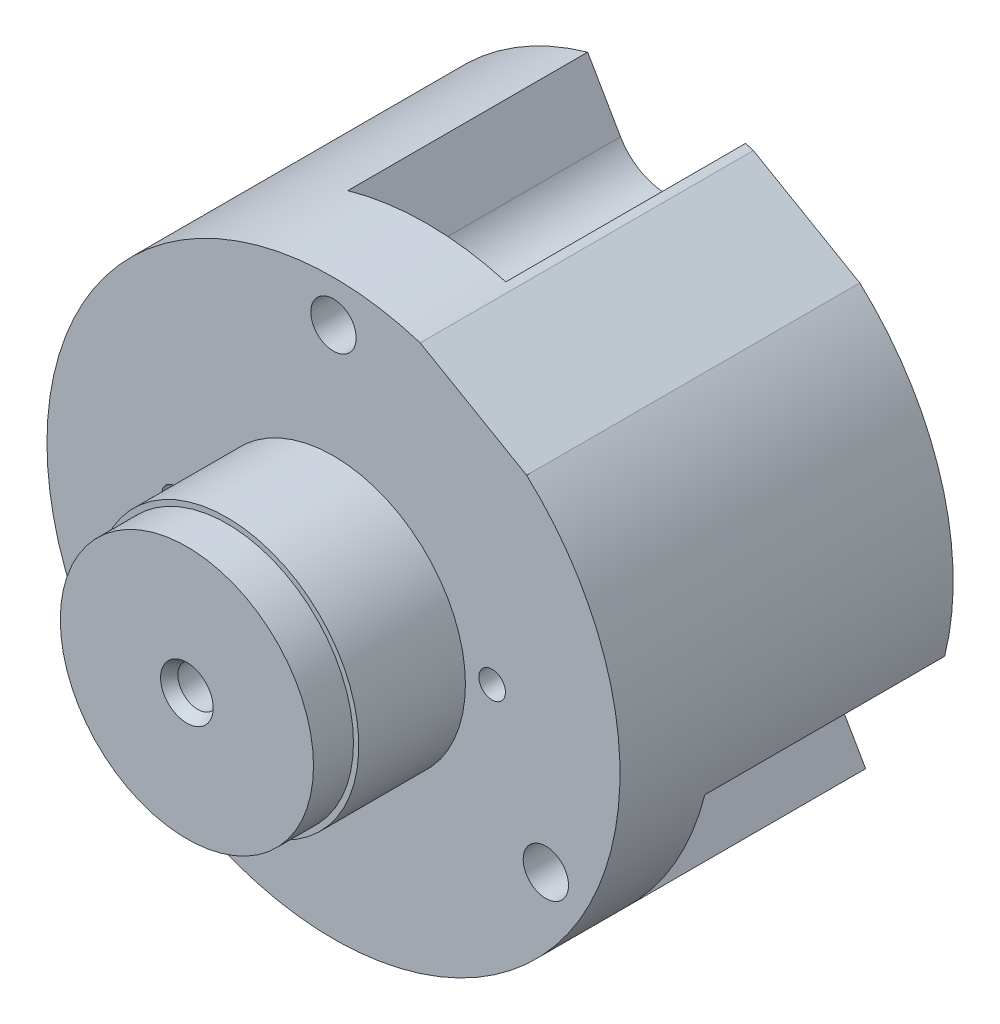
ISO-10303-21;
HEADER;
FILE_DESCRIPTION(('STEP AP214'),'2;1');
FILE_NAME('part.step','',(''),(''),'','','');
FILE_SCHEMA(('AUTOMOTIVE_DESIGN { 1 0 10303 214 1 1 1 1 }'));
ENDSEC;
DATA;
#1=APPLICATION_CONTEXT('core data for automotive mechanical design processes');
#2=APPLICATION_PROTOCOL_DEFINITION('international standard','automotive_design',2000,#1);
#3=PRODUCT_CONTEXT('',#1,'mechanical');
#4=PRODUCT('Part','Part','',(#3));
#5=PRODUCT_RELATED_PRODUCT_CATEGORY('part','',(#4));
#6=PRODUCT_DEFINITION_FORMATION('','',#4);
#7=PRODUCT_DEFINITION_CONTEXT('part definition',#1,'design');
#8=PRODUCT_DEFINITION('design','',#6,#7);
#9=PRODUCT_DEFINITION_SHAPE('','',#8);
#10=(LENGTH_UNIT() NAMED_UNIT(*) SI_UNIT(.MILLI.,.METRE.));
#11=(NAMED_UNIT(*) PLANE_ANGLE_UNIT() SI_UNIT($,.RADIAN.));
#12=(NAMED_UNIT(*) SI_UNIT($,.STERADIAN.) SOLID_ANGLE_UNIT());
#13=UNCERTAINTY_MEASURE_WITH_UNIT(LENGTH_MEASURE(1.E-05),#10,'distance_accuracy_value','');
#14=(GEOMETRIC_REPRESENTATION_CONTEXT(3) GLOBAL_UNCERTAINTY_ASSIGNED_CONTEXT((#13)) GLOBAL_UNIT_ASSIGNED_CONTEXT((#10,
#11,#12)) REPRESENTATION_CONTEXT('',''));
#15=CARTESIAN_POINT('',(0.,0.,0.));
#16=DIRECTION('',(0.,0.,1.));
#17=DIRECTION('',(1.,0.,0.));
#18=AXIS2_PLACEMENT_3D('',#15,#16,#17);
#19=CARTESIAN_POINT('',(0.,0.,-2.));
#20=DIRECTION('',(0.,0.,1.));
#21=DIRECTION('',(1.,0.,0.));
#22=AXIS2_PLACEMENT_3D('',#19,#20,#21);
#23=CYLINDRICAL_SURFACE('',#22,21.5);
#24=DIRECTION('',(0.,0.,-1.));
#25=VECTOR('',#24,1.);
#26=CARTESIAN_POINT('',(14.9341757856194,-15.4667512297903,16.));
#27=LINE('',#26,#25);
#28=CARTESIAN_POINT('',(14.9341757856194,-15.4667512297903,16.));
#29=VERTEX_POINT('',#28);
#30=CARTESIAN_POINT('',(14.9341757856194,-15.4667512297903,-2.));
#31=VERTEX_POINT('',#30);
#32=EDGE_CURVE('E248',#29,#31,#27,.T.);
#33=ORIENTED_EDGE('',*,*,#32,.F.);
#34=CARTESIAN_POINT('',(0.,0.,16.));
#35=DIRECTION('',(0.,0.,-1.));
#36=DIRECTION('',(-1.,0.,0.));
#37=AXIS2_PLACEMENT_3D('',#34,#35,#36);
#38=CIRCLE('',#37,21.5);
#39=CARTESIAN_POINT('',(20.8616873718223,-5.20000000003373,16.));
#40=VERTEX_POINT('',#39);
#41=EDGE_CURVE('E235',#40,#29,#38,.T.);
#42=ORIENTED_EDGE('',*,*,#41,.F.);
#43=DIRECTION('',(0.,0.,-1.));
#44=VECTOR('',#43,1.);
#45=CARTESIAN_POINT('',(20.8616873718223,-5.20000000003373,16.));
#46=LINE('',#45,#44);
#47=CARTESIAN_POINT('',(20.8616873718223,-5.20000000003373,-2.));
#48=VERTEX_POINT('',#47);
#49=EDGE_CURVE('E250',#40,#48,#46,.T.);
#50=ORIENTED_EDGE('',*,*,#49,.T.);
#51=CARTESIAN_POINT('',(0.,0.,-2.));
#52=DIRECTION('',(0.,0.,1.));
#53=DIRECTION('',(1.,0.,0.));
#54=AXIS2_PLACEMENT_3D('',#51,#52,#53);
#55=CIRCLE('',#54,21.5);
#56=CARTESIAN_POINT('',(14.4921798556671,15.8816473651506,-2.));
#57=VERTEX_POINT('',#56);
#58=EDGE_CURVE('E314',#48,#57,#55,.T.);
#59=ORIENTED_EDGE('',*,*,#58,.T.);
#60=DIRECTION('',(0.,0.,1.));
#61=VECTOR('',#60,1.);
#62=CARTESIAN_POINT('',(14.4921798556671,15.8816473651506,-2.));
#63=LINE('',#62,#61);
#64=CARTESIAN_POINT('',(14.4921798556671,15.8816473651506,23.));
#65=VERTEX_POINT('',#64);
#66=EDGE_CURVE('E317',#57,#65,#63,.T.);
#67=ORIENTED_EDGE('',*,*,#66,.T.);
#68=CARTESIAN_POINT('',(0.,0.,23.));
#69=DIRECTION('',(0.,0.,1.));
#70=DIRECTION('',(1.,0.,0.));
#71=AXIS2_PLACEMENT_3D('',#68,#69,#70);
#72=CIRCLE('',#71,21.5);
#73=CARTESIAN_POINT('',(6.50782014433379,20.4914195937959,23.));
#74=VERTEX_POINT('',#73);
#75=EDGE_CURVE('E301',#74,#65,#72,.T.);
#76=ORIENTED_EDGE('',*,*,#75,.F.);
#77=DIRECTION('',(0.,0.,1.));
#78=VECTOR('',#77,1.);
#79=CARTESIAN_POINT('',(6.50782014433379,20.4914195937959,-2.));
#80=LINE('',#79,#78);
#81=CARTESIAN_POINT('',(6.50782014433379,20.4914195937959,-2.));
#82=VERTEX_POINT('',#81);
#83=EDGE_CURVE('E323',#82,#74,#80,.T.);
#84=ORIENTED_EDGE('',*,*,#83,.F.);
#85=CARTESIAN_POINT('',(5.92751158620286,20.666751229824,-2.));
#86=VERTEX_POINT('',#85);
#87=EDGE_CURVE('E309',#82,#86,#55,.T.);
#88=ORIENTED_EDGE('',*,*,#87,.T.);
#89=DIRECTION('',(0.,0.,-1.));
#90=VECTOR('',#89,1.);
#91=CARTESIAN_POINT('',(5.92751158620286,20.666751229824,16.));
#92=LINE('',#91,#90);
#93=CARTESIAN_POINT('',(5.92751158620286,20.666751229824,16.));
#94=VERTEX_POINT('',#93);
#95=EDGE_CURVE('E302',#94,#86,#92,.T.);
#96=ORIENTED_EDGE('',*,*,#95,.F.);
#97=CARTESIAN_POINT('',(0.,0.,16.));
#98=DIRECTION('',(0.,0.,-1.));
#99=DIRECTION('',(-1.,0.,0.));
#100=AXIS2_PLACEMENT_3D('',#97,#98,#99);
#101=CIRCLE('',#100,21.5);
#102=CARTESIAN_POINT('',(-5.92751158620285,20.666751229824,16.));
#103=VERTEX_POINT('',#102);
#104=EDGE_CURVE('E288',#103,#94,#101,.T.);
#105=ORIENTED_EDGE('',*,*,#104,.F.);
#106=DIRECTION('',(0.,0.,-1.));
#107=VECTOR('',#106,1.);
#108=CARTESIAN_POINT('',(-5.92751158620285,20.666751229824,16.));
#109=LINE('',#108,#107);
#110=CARTESIAN_POINT('',(-5.92751158620285,20.666751229824,-2.));
#111=VERTEX_POINT('',#110);
#112=EDGE_CURVE('E304',#103,#111,#109,.T.);
#113=ORIENTED_EDGE('',*,*,#112,.T.);
#114=CARTESIAN_POINT('',(-20.8616873718223,-5.20000000003373,-2.));
#115=VERTEX_POINT('',#114);
#116=EDGE_CURVE('E313',#111,#115,#55,.T.);
#117=ORIENTED_EDGE('',*,*,#116,.T.);
#118=DIRECTION('',(0.,0.,-1.));
#119=VECTOR('',#118,1.);
#120=CARTESIAN_POINT('',(-20.8616873718223,-5.20000000003373,16.));
#121=LINE('',#120,#119);
#122=CARTESIAN_POINT('',(-20.8616873718223,-5.20000000003373,16.));
#123=VERTEX_POINT('',#122);
#124=EDGE_CURVE('E275',#123,#115,#121,.T.);
#125=ORIENTED_EDGE('',*,*,#124,.F.);
#126=CARTESIAN_POINT('',(0.,0.,16.));
#127=DIRECTION('',(0.,0.,-1.));
#128=DIRECTION('',(-1.,0.,0.));
#129=AXIS2_PLACEMENT_3D('',#126,#127,#128);
#130=CIRCLE('',#129,21.5);
#131=CARTESIAN_POINT('',(-14.9341757856194,-15.4667512297902,16.));
#132=VERTEX_POINT('',#131);
#133=EDGE_CURVE('E261',#132,#123,#130,.T.);
#134=ORIENTED_EDGE('',*,*,#133,.F.);
#135=DIRECTION('',(0.,0.,-1.));
#136=VECTOR('',#135,1.);
#137=CARTESIAN_POINT('',(-14.9341757856194,-15.4667512297902,16.));
#138=LINE('',#137,#136);
#139=CARTESIAN_POINT('',(-14.9341757856194,-15.4667512297902,-2.));
#140=VERTEX_POINT('',#139);
#141=EDGE_CURVE('E277',#132,#140,#138,.T.);
#142=ORIENTED_EDGE('',*,*,#141,.T.);
#143=EDGE_CURVE('E508',#140,#31,#55,.T.);
#144=ORIENTED_EDGE('',*,*,#143,.T.);
#145=EDGE_LOOP('',(#33,#42,#50,#59,#67,#76,#84,#88,#96,#105,#113,#117,#125,#134,#142,#144));
#146=FACE_BOUND('',#145,.T.);
#147=ADVANCED_FACE('F36',(#146),#23,.T.);
#148=CARTESIAN_POINT('',(14.4921798556671,15.8816473651506,-2.));
#149=DIRECTION('',(0.500000000000015,0.86602540378443,0.));
#150=DIRECTION('',(-0.86602540378443,0.500000000000015,0.));
#151=AXIS2_PLACEMENT_3D('',#148,#149,#150);
#152=PLANE('',#151);
#153=DIRECTION('',(-0.86602540378443,0.500000000000015,0.));
#154=VECTOR('',#153,1.);
#155=CARTESIAN_POINT('',(14.4921798556671,15.8816473651506,23.));
#156=LINE('',#155,#154);
#157=EDGE_CURVE('E320',#65,#74,#156,.T.);
#158=ORIENTED_EDGE('',*,*,#157,.F.);
#159=ORIENTED_EDGE('',*,*,#66,.F.);
#160=DIRECTION('',(-0.86602540378443,0.500000000000015,0.));
#161=VECTOR('',#160,1.);
#162=CARTESIAN_POINT('',(14.4921798556671,15.8816473651506,-2.));
#163=LINE('',#162,#161);
#164=EDGE_CURVE('E312',#57,#82,#163,.T.);
#165=ORIENTED_EDGE('',*,*,#164,.T.);
#166=ORIENTED_EDGE('',*,*,#83,.T.);
#167=EDGE_LOOP('',(#158,#159,#165,#166));
#168=FACE_BOUND('',#167,.T.);
#169=ADVANCED_FACE('F348',(#168),#152,.T.);
#170=CARTESIAN_POINT('',(0.,0.,-2.));
#171=DIRECTION('',(0.,0.,1.));
#172=DIRECTION('',(1.,0.,0.));
#173=AXIS2_PLACEMENT_3D('',#170,#171,#172);
#174=PLANE('',#173);
#175=CARTESIAN_POINT('',(5.54908495762116,9.49794022813307,-2.));
#176=DIRECTION('',(0.,0.,-1.));
#177=DIRECTION('',(-1.,0.,0.));
#178=AXIS2_PLACEMENT_3D('',#175,#176,#177);
#179=CIRCLE('',#178,1.24999999999999);
#180=CARTESIAN_POINT('',(4.29908495762117,9.49794022813307,-2.));
#181=VERTEX_POINT('',#180);
#182=EDGE_CURVE('E174',#181,#181,#179,.T.);
#183=ORIENTED_EDGE('',*,*,#182,.F.);
#184=EDGE_LOOP('',(#183));
#185=FACE_BOUND('',#184,.T.);
#186=CARTESIAN_POINT('',(-5.45091504237914,-9.55461865512437,-2.));
#187=DIRECTION('',(0.,0.,-1.));
#188=DIRECTION('',(-1.,0.,0.));
#189=AXIS2_PLACEMENT_3D('',#186,#187,#188);
#190=CIRCLE('',#189,1.24999999999999);
#191=CARTESIAN_POINT('',(-6.70091504237913,-9.55461865512437,-2.));
#192=VERTEX_POINT('',#191);
#193=EDGE_CURVE('E180',#192,#192,#190,.T.);
#194=ORIENTED_EDGE('',*,*,#193,.F.);
#195=EDGE_LOOP('',(#194));
#196=FACE_BOUND('',#195,.T.);
#197=CARTESIAN_POINT('',(8.50000000000025,14.7224318643353,-2.));
#198=DIRECTION('',(0.,0.,-1.));
#199=DIRECTION('',(-1.,0.,0.));
#200=AXIS2_PLACEMENT_3D('',#197,#198,#199);
#201=CIRCLE('',#200,1.24999999999999);
#202=CARTESIAN_POINT('',(7.25000000000026,14.7224318643353,-2.));
#203=VERTEX_POINT('',#202);
#204=EDGE_CURVE('E186',#203,#203,#201,.T.);
#205=ORIENTED_EDGE('',*,*,#204,.F.);
#206=EDGE_LOOP('',(#205));
#207=FACE_BOUND('',#206,.T.);
#208=CARTESIAN_POINT('',(-8.50000000000025,-14.7224318643353,-2.));
#209=DIRECTION('',(0.,0.,-1.));
#210=DIRECTION('',(-1.,0.,0.));
#211=AXIS2_PLACEMENT_3D('',#208,#209,#210);
#212=CIRCLE('',#211,1.24999999999999);
#213=CARTESIAN_POINT('',(-9.75000000000024,-14.7224318643353,-2.));
#214=VERTEX_POINT('',#213);
#215=EDGE_CURVE('E192',#214,#214,#212,.T.);
#216=ORIENTED_EDGE('',*,*,#215,.F.);
#217=EDGE_LOOP('',(#216));
#218=FACE_BOUND('',#217,.T.);
#219=CARTESIAN_POINT('',(0.,0.,-2.));
#220=DIRECTION('',(0.,0.,1.));
#221=DIRECTION('',(1.,0.,0.));
#222=AXIS2_PLACEMENT_3D('',#219,#220,#221);
#223=CIRCLE('',#222,1.49999999999999);
#224=CARTESIAN_POINT('',(1.49999999999999,0.,-2.));
#225=VERTEX_POINT('',#224);
#226=EDGE_CURVE('E198',#225,#225,#223,.T.);
#227=ORIENTED_EDGE('',*,*,#226,.T.);
#228=EDGE_LOOP('',(#227));
#229=FACE_BOUND('',#228,.T.);
#230=CARTESIAN_POINT('',(15.9348674296921,-9.20000000003374,-2.));
#231=DIRECTION('',(0.,0.,-1.));
#232=DIRECTION('',(-1.,0.,0.));
#233=AXIS2_PLACEMENT_3D('',#230,#231,#232);
#234=CIRCLE('',#233,4.);
#235=CARTESIAN_POINT('',(12.4707658145543,-11.2000000000337,-2.));
#236=VERTEX_POINT('',#235);
#237=CARTESIAN_POINT('',(15.9348674296921,-5.20000000003374,-2.));
#238=VERTEX_POINT('',#237);
#239=EDGE_CURVE('E51',#236,#238,#234,.T.);
#240=ORIENTED_EDGE('',*,*,#239,.F.);
#241=DIRECTION('',(-0.499999999999999,0.866025403784439,0.));
#242=VECTOR('',#241,1.);
#243=CARTESIAN_POINT('',(14.9341757856194,-15.4667512297903,-2.));
#244=LINE('',#243,#242);
#245=EDGE_CURVE('E232',#31,#236,#244,.T.);
#246=ORIENTED_EDGE('',*,*,#245,.F.);
#247=ORIENTED_EDGE('',*,*,#143,.F.);
#248=DIRECTION('',(-0.499999999999999,-0.866025403784439,0.));
#249=VECTOR('',#248,1.);
#250=CARTESIAN_POINT('',(-12.4707658145543,-11.2000000000337,-2.));
#251=LINE('',#250,#249);
#252=CARTESIAN_POINT('',(-12.4707658145543,-11.2000000000337,-2.));
#253=VERTEX_POINT('',#252);
#254=EDGE_CURVE('E268',#253,#140,#251,.T.);
#255=ORIENTED_EDGE('',*,*,#254,.F.);
#256=CARTESIAN_POINT('',(-15.9348674296921,-9.20000000003373,-2.));
#257=DIRECTION('',(0.,0.,-1.));
#258=DIRECTION('',(-1.,0.,0.));
#259=AXIS2_PLACEMENT_3D('',#256,#257,#258);
#260=CIRCLE('',#259,4.00000000000001);
#261=CARTESIAN_POINT('',(-15.9348674296921,-5.20000000003372,-2.));
#262=VERTEX_POINT('',#261);
#263=EDGE_CURVE('E59',#262,#253,#260,.T.);
#264=ORIENTED_EDGE('',*,*,#263,.F.);
#265=DIRECTION('',(1.,0.,0.));
#266=VECTOR('',#265,1.);
#267=CARTESIAN_POINT('',(-20.8616873718223,-5.20000000003373,-2.));
#268=LINE('',#267,#266);
#269=EDGE_CURVE('E258',#115,#262,#268,.T.);
#270=ORIENTED_EDGE('',*,*,#269,.F.);
#271=ORIENTED_EDGE('',*,*,#116,.F.);
#272=DIRECTION('',(-0.5,0.866025403784438,0.));
#273=VECTOR('',#272,1.);
#274=CARTESIAN_POINT('',(-3.46410161513775,16.4000000000675,-2.));
#275=LINE('',#274,#273);
#276=CARTESIAN_POINT('',(-3.46410161513775,16.4000000000675,-2.));
#277=VERTEX_POINT('',#276);
#278=EDGE_CURVE('E295',#277,#111,#275,.T.);
#279=ORIENTED_EDGE('',*,*,#278,.F.);
#280=CARTESIAN_POINT('',(0.,18.4000000000675,-2.));
#281=DIRECTION('',(0.,0.,-1.));
#282=DIRECTION('',(-1.,0.,0.));
#283=AXIS2_PLACEMENT_3D('',#280,#281,#282);
#284=CIRCLE('',#283,4.);
#285=CARTESIAN_POINT('',(3.46410161513775,16.4000000000675,-2.));
#286=VERTEX_POINT('',#285);
#287=EDGE_CURVE('E274',#286,#277,#284,.T.);
#288=ORIENTED_EDGE('',*,*,#287,.F.);
#289=DIRECTION('',(-0.500000000000002,-0.866025403784438,0.));
#290=VECTOR('',#289,1.);
#291=CARTESIAN_POINT('',(5.92751158620286,20.666751229824,-2.));
#292=LINE('',#291,#290);
#293=EDGE_CURVE('E285',#86,#286,#292,.T.);
#294=ORIENTED_EDGE('',*,*,#293,.F.);
#295=ORIENTED_EDGE('',*,*,#87,.F.);
#296=ORIENTED_EDGE('',*,*,#164,.F.);
#297=ORIENTED_EDGE('',*,*,#58,.F.);
#298=DIRECTION('',(1.,0.,0.));
#299=VECTOR('',#298,1.);
#300=CARTESIAN_POINT('',(15.9348674296921,-5.20000000003374,-2.));
#301=LINE('',#300,#299);
#302=EDGE_CURVE('E242',#238,#48,#301,.T.);
#303=ORIENTED_EDGE('',*,*,#302,.F.);
#304=EDGE_LOOP('',(#240,#246,#247,#255,#264,#270,#271,#279,#288,#294,#295,#296,#297,#303));
#305=FACE_BOUND('',#304,.T.);
#306=ADVANCED_FACE('F353',(#185,#196,#207,#218,#229,#305),#174,.F.);
#307=CARTESIAN_POINT('',(0.,0.,23.));
#308=DIRECTION('',(0.,0.,1.));
#309=DIRECTION('',(1.,0.,0.));
#310=AXIS2_PLACEMENT_3D('',#307,#308,#309);
#311=PLANE('',#310);
#312=CARTESIAN_POINT('',(-11.8870489570875,0.98897274573418,23.));
#313=DIRECTION('',(0.,0.,1.));
#314=DIRECTION('',(1.,0.,0.));
#315=AXIS2_PLACEMENT_3D('',#312,#313,#314);
#316=CIRCLE('',#315,0.999999999999999);
#317=CARTESIAN_POINT('',(-10.8870489570875,0.98897274573418,23.));
#318=VERTEX_POINT('',#317);
#319=EDGE_CURVE('E164',#318,#318,#316,.T.);
#320=ORIENTED_EDGE('',*,*,#319,.F.);
#321=EDGE_LOOP('',(#320));
#322=FACE_BOUND('',#321,.T.);
#323=CARTESIAN_POINT('',(11.9030743608719,0.983270440699366,23.));
#324=DIRECTION('',(0.,0.,1.));
#325=DIRECTION('',(1.,0.,0.));
#326=AXIS2_PLACEMENT_3D('',#323,#324,#325);
#327=CIRCLE('',#326,0.999999999999999);
#328=CARTESIAN_POINT('',(12.9030743608719,0.983270440699366,23.));
#329=VERTEX_POINT('',#328);
#330=EDGE_CURVE('E163',#329,#329,#327,.T.);
#331=ORIENTED_EDGE('',*,*,#330,.F.);
#332=EDGE_LOOP('',(#331));
#333=FACE_BOUND('',#332,.T.);
#334=CARTESIAN_POINT('',(0.,18.4000000000675,23.));
#335=DIRECTION('',(0.,0.,1.));
#336=DIRECTION('',(1.,0.,0.));
#337=AXIS2_PLACEMENT_3D('',#334,#335,#336);
#338=CIRCLE('',#337,1.69999999999999);
#339=CARTESIAN_POINT('',(1.69999999999999,18.4000000000675,23.));
#340=VERTEX_POINT('',#339);
#341=EDGE_CURVE('E204',#340,#340,#338,.T.);
#342=ORIENTED_EDGE('',*,*,#341,.F.);
#343=EDGE_LOOP('',(#342));
#344=FACE_BOUND('',#343,.T.);
#345=CARTESIAN_POINT('',(-15.9348674296921,-9.20000000003374,23.));
#346=DIRECTION('',(0.,0.,1.));
#347=DIRECTION('',(1.,0.,0.));
#348=AXIS2_PLACEMENT_3D('',#345,#346,#347);
#349=CIRCLE('',#348,1.69999999999999);
#350=CARTESIAN_POINT('',(-14.2348674296921,-9.20000000003374,23.));
#351=VERTEX_POINT('',#350);
#352=EDGE_CURVE('E210',#351,#351,#349,.T.);
#353=ORIENTED_EDGE('',*,*,#352,.F.);
#354=EDGE_LOOP('',(#353));
#355=FACE_BOUND('',#354,.T.);
#356=CARTESIAN_POINT('',(15.9348674296921,-9.20000000003374,23.));
#357=DIRECTION('',(0.,0.,1.));
#358=DIRECTION('',(1.,0.,0.));
#359=AXIS2_PLACEMENT_3D('',#356,#357,#358);
#360=CIRCLE('',#359,1.69999999999999);
#361=CARTESIAN_POINT('',(17.6348674296921,-9.20000000003374,23.));
#362=VERTEX_POINT('',#361);
#363=EDGE_CURVE('E216',#362,#362,#360,.T.);
#364=ORIENTED_EDGE('',*,*,#363,.F.);
#365=EDGE_LOOP('',(#364));
#366=FACE_BOUND('',#365,.T.);
#367=CARTESIAN_POINT('',(0.,0.,23.));
#368=DIRECTION('',(0.,0.,1.));
#369=DIRECTION('',(1.,0.,0.));
#370=AXIS2_PLACEMENT_3D('',#367,#368,#369);
#371=CIRCLE('',#370,9.9);
#372=CARTESIAN_POINT('',(9.9,0.,23.));
#373=VERTEX_POINT('',#372);
#374=EDGE_CURVE('E325',#373,#373,#371,.T.);
#375=ORIENTED_EDGE('',*,*,#374,.F.);
#376=EDGE_LOOP('',(#375));
#377=FACE_BOUND('',#376,.T.);
#378=ORIENTED_EDGE('',*,*,#75,.T.);
#379=ORIENTED_EDGE('',*,*,#157,.T.);
#380=EDGE_LOOP('',(#378,#379));
#381=FACE_BOUND('',#380,.T.);
#382=ADVANCED_FACE('F358',(#322,#333,#344,#355,#366,#377,#381),#311,.T.);
#383=CARTESIAN_POINT('',(0.,18.4000000000675,16.));
#384=DIRECTION('',(0.,0.,-1.));
#385=DIRECTION('',(-1.,0.,0.));
#386=AXIS2_PLACEMENT_3D('',#383,#384,#385);
#387=CYLINDRICAL_SURFACE('',#386,4.);
#388=ORIENTED_EDGE('',*,*,#287,.T.);
#389=DIRECTION('',(0.,0.,-1.));
#390=VECTOR('',#389,1.);
#391=CARTESIAN_POINT('',(-3.46410161513775,16.4000000000675,16.));
#392=LINE('',#391,#390);
#393=CARTESIAN_POINT('',(-3.46410161513775,16.4000000000675,16.));
#394=VERTEX_POINT('',#393);
#395=EDGE_CURVE('E293',#394,#277,#392,.T.);
#396=ORIENTED_EDGE('',*,*,#395,.F.);
#397=CARTESIAN_POINT('',(0.,18.4000000000675,16.));
#398=DIRECTION('',(0.,0.,-1.));
#399=DIRECTION('',(-1.,0.,0.));
#400=AXIS2_PLACEMENT_3D('',#397,#398,#399);
#401=CIRCLE('',#400,4.);
#402=CARTESIAN_POINT('',(3.46410161513775,16.4000000000675,16.));
#403=VERTEX_POINT('',#402);
#404=EDGE_CURVE('E281',#403,#394,#401,.T.);
#405=ORIENTED_EDGE('',*,*,#404,.F.);
#406=DIRECTION('',(0.,0.,-1.));
#407=VECTOR('',#406,1.);
#408=CARTESIAN_POINT('',(3.46410161513775,16.4000000000675,16.));
#409=LINE('',#408,#407);
#410=EDGE_CURVE('E299',#403,#286,#409,.T.);
#411=ORIENTED_EDGE('',*,*,#410,.T.);
#412=EDGE_LOOP('',(#388,#396,#405,#411));
#413=FACE_BOUND('',#412,.T.);
#414=ADVANCED_FACE('F361',(#413),#387,.F.);
#415=CARTESIAN_POINT('',(5.92751158620286,20.666751229824,16.));
#416=DIRECTION('',(0.866025403784438,-0.500000000000002,0.));
#417=DIRECTION('',(0.500000000000002,0.866025403784438,0.));
#418=AXIS2_PLACEMENT_3D('',#415,#416,#417);
#419=PLANE('',#418);
#420=ORIENTED_EDGE('',*,*,#293,.T.);
#421=ORIENTED_EDGE('',*,*,#410,.F.);
#422=DIRECTION('',(-0.500000000000002,-0.866025403784438,0.));
#423=VECTOR('',#422,1.);
#424=CARTESIAN_POINT('',(5.92751158620286,20.666751229824,16.));
#425=LINE('',#424,#423);
#426=EDGE_CURVE('E290',#94,#403,#425,.T.);
#427=ORIENTED_EDGE('',*,*,#426,.F.);
#428=ORIENTED_EDGE('',*,*,#95,.T.);
#429=EDGE_LOOP('',(#420,#421,#427,#428));
#430=FACE_BOUND('',#429,.T.);
#431=ADVANCED_FACE('F368',(#430),#419,.F.);
#432=CARTESIAN_POINT('',(-3.46410161513775,16.4000000000675,16.));
#433=DIRECTION('',(-0.866025403784438,-0.5,0.));
#434=DIRECTION('',(0.500000000000001,-0.866025403784438,0.));
#435=AXIS2_PLACEMENT_3D('',#432,#433,#434);
#436=PLANE('',#435);
#437=ORIENTED_EDGE('',*,*,#278,.T.);
#438=ORIENTED_EDGE('',*,*,#112,.F.);
#439=DIRECTION('',(-0.5,0.866025403784438,0.));
#440=VECTOR('',#439,1.);
#441=CARTESIAN_POINT('',(-3.46410161513775,16.4000000000675,16.));
#442=LINE('',#441,#440);
#443=EDGE_CURVE('E284',#394,#103,#442,.T.);
#444=ORIENTED_EDGE('',*,*,#443,.F.);
#445=ORIENTED_EDGE('',*,*,#395,.T.);
#446=EDGE_LOOP('',(#437,#438,#444,#445));
#447=FACE_BOUND('',#446,.T.);
#448=ADVANCED_FACE('F370',(#447),#436,.F.);
#449=CARTESIAN_POINT('',(0.,18.4000000000675,16.));
#450=DIRECTION('',(0.,0.,-1.));
#451=DIRECTION('',(-1.,0.,0.));
#452=AXIS2_PLACEMENT_3D('',#449,#450,#451);
#453=PLANE('',#452);
#454=CARTESIAN_POINT('',(0.,18.4000000000675,16.));
#455=DIRECTION('',(0.,0.,-1.));
#456=DIRECTION('',(-1.,0.,0.));
#457=AXIS2_PLACEMENT_3D('',#454,#455,#456);
#458=CIRCLE('',#457,1.69999999999998);
#459=CARTESIAN_POINT('',(-1.69999999999998,18.4000000000675,16.));
#460=VERTEX_POINT('',#459);
#461=EDGE_CURVE('E201',#460,#460,#458,.T.);
#462=ORIENTED_EDGE('',*,*,#461,.F.);
#463=EDGE_LOOP('',(#462));
#464=FACE_BOUND('',#463,.T.);
#465=ORIENTED_EDGE('',*,*,#404,.T.);
#466=ORIENTED_EDGE('',*,*,#443,.T.);
#467=ORIENTED_EDGE('',*,*,#104,.T.);
#468=ORIENTED_EDGE('',*,*,#426,.T.);
#469=EDGE_LOOP('',(#465,#466,#467,#468));
#470=FACE_BOUND('',#469,.T.);
#471=ADVANCED_FACE('F373',(#464,#470),#453,.T.);
#472=CARTESIAN_POINT('',(-15.9348674296921,-9.20000000003373,16.));
#473=DIRECTION('',(0.,0.,-1.));
#474=DIRECTION('',(-1.,0.,0.));
#475=AXIS2_PLACEMENT_3D('',#472,#473,#474);
#476=CYLINDRICAL_SURFACE('',#475,4.00000000000001);
#477=ORIENTED_EDGE('',*,*,#263,.T.);
#478=DIRECTION('',(0.,0.,-1.));
#479=VECTOR('',#478,1.);
#480=CARTESIAN_POINT('',(-12.4707658145543,-11.2000000000337,16.));
#481=LINE('',#480,#479);
#482=CARTESIAN_POINT('',(-12.4707658145543,-11.2000000000337,16.));
#483=VERTEX_POINT('',#482);
#484=EDGE_CURVE('E266',#483,#253,#481,.T.);
#485=ORIENTED_EDGE('',*,*,#484,.F.);
#486=CARTESIAN_POINT('',(-15.9348674296921,-9.20000000003373,16.));
#487=DIRECTION('',(0.,0.,-1.));
#488=DIRECTION('',(-1.,0.,0.));
#489=AXIS2_PLACEMENT_3D('',#486,#487,#488);
#490=CIRCLE('',#489,4.00000000000001);
#491=CARTESIAN_POINT('',(-15.9348674296921,-5.20000000003372,16.));
#492=VERTEX_POINT('',#491);
#493=EDGE_CURVE('E254',#492,#483,#490,.T.);
#494=ORIENTED_EDGE('',*,*,#493,.F.);
#495=DIRECTION('',(0.,0.,-1.));
#496=VECTOR('',#495,1.);
#497=CARTESIAN_POINT('',(-15.9348674296921,-5.20000000003372,16.));
#498=LINE('',#497,#496);
#499=EDGE_CURVE('E272',#492,#262,#498,.T.);
#500=ORIENTED_EDGE('',*,*,#499,.T.);
#501=EDGE_LOOP('',(#477,#485,#494,#500));
#502=FACE_BOUND('',#501,.T.);
#503=ADVANCED_FACE('F380',(#502),#476,.F.);
#504=CARTESIAN_POINT('',(-20.8616873718223,-5.20000000003373,16.));
#505=DIRECTION('',(0.,1.,0.));
#506=DIRECTION('',(-1.,0.,0.));
#507=AXIS2_PLACEMENT_3D('',#504,#505,#506);
#508=PLANE('',#507);
#509=ORIENTED_EDGE('',*,*,#269,.T.);
#510=ORIENTED_EDGE('',*,*,#499,.F.);
#511=DIRECTION('',(1.,0.,0.));
#512=VECTOR('',#511,1.);
#513=CARTESIAN_POINT('',(-20.8616873718223,-5.20000000003373,16.));
#514=LINE('',#513,#512);
#515=EDGE_CURVE('E263',#123,#492,#514,.T.);
#516=ORIENTED_EDGE('',*,*,#515,.F.);
#517=ORIENTED_EDGE('',*,*,#124,.T.);
#518=EDGE_LOOP('',(#509,#510,#516,#517));
#519=FACE_BOUND('',#518,.T.);
#520=ADVANCED_FACE('F384',(#519),#508,.F.);
#521=CARTESIAN_POINT('',(-12.4707658145543,-11.2000000000337,16.));
#522=DIRECTION('',(0.866025403784439,-0.499999999999999,0.));
#523=DIRECTION('',(0.5,0.866025403784439,0.));
#524=AXIS2_PLACEMENT_3D('',#521,#522,#523);
#525=PLANE('',#524);
#526=ORIENTED_EDGE('',*,*,#254,.T.);
#527=ORIENTED_EDGE('',*,*,#141,.F.);
#528=DIRECTION('',(-0.499999999999999,-0.866025403784439,0.));
#529=VECTOR('',#528,1.);
#530=CARTESIAN_POINT('',(-12.4707658145543,-11.2000000000337,16.));
#531=LINE('',#530,#529);
#532=EDGE_CURVE('E257',#483,#132,#531,.T.);
#533=ORIENTED_EDGE('',*,*,#532,.F.);
#534=ORIENTED_EDGE('',*,*,#484,.T.);
#535=EDGE_LOOP('',(#526,#527,#533,#534));
#536=FACE_BOUND('',#535,.T.);
#537=ADVANCED_FACE('F385',(#536),#525,.F.);
#538=CARTESIAN_POINT('',(-15.9348674296921,-9.20000000003373,16.));
#539=DIRECTION('',(0.,0.,-1.));
#540=DIRECTION('',(-1.,0.,0.));
#541=AXIS2_PLACEMENT_3D('',#538,#539,#540);
#542=PLANE('',#541);
#543=CARTESIAN_POINT('',(-15.9348674296921,-9.20000000003374,16.));
#544=DIRECTION('',(0.,0.,-1.));
#545=DIRECTION('',(-1.,0.,0.));
#546=AXIS2_PLACEMENT_3D('',#543,#544,#545);
#547=CIRCLE('',#546,1.69999999999998);
#548=CARTESIAN_POINT('',(-17.6348674296921,-9.20000000003374,16.));
#549=VERTEX_POINT('',#548);
#550=EDGE_CURVE('E207',#549,#549,#547,.T.);
#551=ORIENTED_EDGE('',*,*,#550,.F.);
#552=EDGE_LOOP('',(#551));
#553=FACE_BOUND('',#552,.T.);
#554=ORIENTED_EDGE('',*,*,#493,.T.);
#555=ORIENTED_EDGE('',*,*,#532,.T.);
#556=ORIENTED_EDGE('',*,*,#133,.T.);
#557=ORIENTED_EDGE('',*,*,#515,.T.);
#558=EDGE_LOOP('',(#554,#555,#556,#557));
#559=FACE_BOUND('',#558,.T.);
#560=ADVANCED_FACE('F388',(#553,#559),#542,.T.);
#561=CARTESIAN_POINT('',(15.9348674296921,-9.20000000003374,16.));
#562=DIRECTION('',(0.,0.,-1.));
#563=DIRECTION('',(-1.,0.,0.));
#564=AXIS2_PLACEMENT_3D('',#561,#562,#563);
#565=CYLINDRICAL_SURFACE('',#564,4.);
#566=ORIENTED_EDGE('',*,*,#239,.T.);
#567=DIRECTION('',(0.,0.,-1.));
#568=VECTOR('',#567,1.);
#569=CARTESIAN_POINT('',(15.9348674296921,-5.20000000003374,16.));
#570=LINE('',#569,#568);
#571=CARTESIAN_POINT('',(15.9348674296921,-5.20000000003374,16.));
#572=VERTEX_POINT('',#571);
#573=EDGE_CURVE('E240',#572,#238,#570,.T.);
#574=ORIENTED_EDGE('',*,*,#573,.F.);
#575=CARTESIAN_POINT('',(15.9348674296921,-9.20000000003374,16.));
#576=DIRECTION('',(0.,0.,-1.));
#577=DIRECTION('',(-1.,0.,0.));
#578=AXIS2_PLACEMENT_3D('',#575,#576,#577);
#579=CIRCLE('',#578,4.);
#580=CARTESIAN_POINT('',(12.4707658145543,-11.2000000000337,16.));
#581=VERTEX_POINT('',#580);
#582=EDGE_CURVE('E228',#581,#572,#579,.T.);
#583=ORIENTED_EDGE('',*,*,#582,.F.);
#584=DIRECTION('',(0.,0.,-1.));
#585=VECTOR('',#584,1.);
#586=CARTESIAN_POINT('',(12.4707658145543,-11.2000000000337,16.));
#587=LINE('',#586,#585);
#588=EDGE_CURVE('E246',#581,#236,#587,.T.);
#589=ORIENTED_EDGE('',*,*,#588,.T.);
#590=EDGE_LOOP('',(#566,#574,#583,#589));
#591=FACE_BOUND('',#590,.T.);
#592=ADVANCED_FACE('F395',(#591),#565,.F.);
#593=CARTESIAN_POINT('',(14.9341757856194,-15.4667512297903,16.));
#594=DIRECTION('',(-0.866025403784439,-0.499999999999999,0.));
#595=DIRECTION('',(0.499999999999999,-0.866025403784439,0.));
#596=AXIS2_PLACEMENT_3D('',#593,#594,#595);
#597=PLANE('',#596);
#598=ORIENTED_EDGE('',*,*,#245,.T.);
#599=ORIENTED_EDGE('',*,*,#588,.F.);
#600=DIRECTION('',(-0.499999999999999,0.866025403784439,0.));
#601=VECTOR('',#600,1.);
#602=CARTESIAN_POINT('',(14.9341757856194,-15.4667512297903,16.));
#603=LINE('',#602,#601);
#604=EDGE_CURVE('E237',#29,#581,#603,.T.);
#605=ORIENTED_EDGE('',*,*,#604,.F.);
#606=ORIENTED_EDGE('',*,*,#32,.T.);
#607=EDGE_LOOP('',(#598,#599,#605,#606));
#608=FACE_BOUND('',#607,.T.);
#609=ADVANCED_FACE('F399',(#608),#597,.F.);
#610=CARTESIAN_POINT('',(15.9348674296921,-5.20000000003374,16.));
#611=DIRECTION('',(0.,1.,0.));
#612=DIRECTION('',(-1.,0.,0.));
#613=AXIS2_PLACEMENT_3D('',#610,#611,#612);
#614=PLANE('',#613);
#615=ORIENTED_EDGE('',*,*,#302,.T.);
#616=ORIENTED_EDGE('',*,*,#49,.F.);
#617=DIRECTION('',(1.,0.,0.));
#618=VECTOR('',#617,1.);
#619=CARTESIAN_POINT('',(15.9348674296921,-5.20000000003374,16.));
#620=LINE('',#619,#618);
#621=EDGE_CURVE('E231',#572,#40,#620,.T.);
#622=ORIENTED_EDGE('',*,*,#621,.F.);
#623=ORIENTED_EDGE('',*,*,#573,.T.);
#624=EDGE_LOOP('',(#615,#616,#622,#623));
#625=FACE_BOUND('',#624,.T.);
#626=ADVANCED_FACE('F400',(#625),#614,.F.);
#627=CARTESIAN_POINT('',(15.9348674296921,-9.20000000003374,16.));
#628=DIRECTION('',(0.,0.,-1.));
#629=DIRECTION('',(-1.,0.,0.));
#630=AXIS2_PLACEMENT_3D('',#627,#628,#629);
#631=PLANE('',#630);
#632=CARTESIAN_POINT('',(15.9348674296921,-9.20000000003374,16.));
#633=DIRECTION('',(0.,0.,-1.));
#634=DIRECTION('',(-1.,0.,0.));
#635=AXIS2_PLACEMENT_3D('',#632,#633,#634);
#636=CIRCLE('',#635,1.69999999999998);
#637=CARTESIAN_POINT('',(14.2348674296921,-9.20000000003374,16.));
#638=VERTEX_POINT('',#637);
#639=EDGE_CURVE('E213',#638,#638,#636,.T.);
#640=ORIENTED_EDGE('',*,*,#639,.F.);
#641=EDGE_LOOP('',(#640));
#642=FACE_BOUND('',#641,.T.);
#643=ORIENTED_EDGE('',*,*,#582,.T.);
#644=ORIENTED_EDGE('',*,*,#621,.T.);
#645=ORIENTED_EDGE('',*,*,#41,.T.);
#646=ORIENTED_EDGE('',*,*,#604,.T.);
#647=EDGE_LOOP('',(#643,#644,#645,#646));
#648=FACE_BOUND('',#647,.T.);
#649=ADVANCED_FACE('F403',(#642,#648),#631,.T.);
#650=CARTESIAN_POINT('',(0.,0.,34.));
#651=DIRECTION('',(0.,0.,-1.));
#652=DIRECTION('',(-1.,0.,0.));
#653=AXIS2_PLACEMENT_3D('',#650,#651,#652);
#654=CYLINDRICAL_SURFACE('',#653,9.5);
#655=CARTESIAN_POINT('',(0.,0.,34.));
#656=DIRECTION('',(0.,0.,-1.));
#657=DIRECTION('',(-1.,0.,0.));
#658=AXIS2_PLACEMENT_3D('',#655,#656,#657);
#659=CIRCLE('',#658,9.5);
#660=CARTESIAN_POINT('',(-9.5,0.,34.));
#661=VERTEX_POINT('',#660);
#662=EDGE_CURVE('E225',#661,#661,#659,.T.);
#663=ORIENTED_EDGE('',*,*,#662,.T.);
#664=EDGE_LOOP('',(#663));
#665=FACE_BOUND('',#664,.T.);
#666=CARTESIAN_POINT('',(0.,0.,31.));
#667=DIRECTION('',(0.,0.,-1.));
#668=DIRECTION('',(-1.,0.,0.));
#669=AXIS2_PLACEMENT_3D('',#666,#667,#668);
#670=CIRCLE('',#669,9.5);
#671=CARTESIAN_POINT('',(-9.5,0.,31.));
#672=VERTEX_POINT('',#671);
#673=EDGE_CURVE('E219',#672,#672,#670,.T.);
#674=ORIENTED_EDGE('',*,*,#673,.F.);
#675=EDGE_LOOP('',(#674));
#676=FACE_BOUND('',#675,.T.);
#677=ADVANCED_FACE('F410',(#665,#676),#654,.T.);
#678=CARTESIAN_POINT('',(9.5,0.,34.));
#679=DIRECTION('',(0.,0.,1.));
#680=DIRECTION('',(1.,0.,0.));
#681=AXIS2_PLACEMENT_3D('',#678,#679,#680);
#682=PLANE('',#681);
#683=CARTESIAN_POINT('',(0.,0.,34.));
#684=DIRECTION('',(0.,0.,1.));
#685=DIRECTION('',(1.,0.,0.));
#686=AXIS2_PLACEMENT_3D('',#683,#684,#685);
#687=CIRCLE('',#686,1.97499999999123);
#688=CARTESIAN_POINT('',(1.97499999999123,0.,34.));
#689=VERTEX_POINT('',#688);
#690=EDGE_CURVE('E11',#689,#689,#687,.F.);
#691=ORIENTED_EDGE('',*,*,#690,.T.);
#692=EDGE_LOOP('',(#691));
#693=FACE_BOUND('',#692,.T.);
#694=ORIENTED_EDGE('',*,*,#662,.F.);
#695=EDGE_LOOP('',(#694));
#696=FACE_BOUND('',#695,.T.);
#697=ADVANCED_FACE('F414',(#693,#696),#682,.T.);
#698=CARTESIAN_POINT('',(0.,0.,34.));
#699=DIRECTION('',(0.,0.,-1.));
#700=DIRECTION('',(-1.,0.,0.));
#701=AXIS2_PLACEMENT_3D('',#698,#699,#700);
#702=CYLINDRICAL_SURFACE('',#701,9.9);
#703=CARTESIAN_POINT('',(0.,0.,31.));
#704=DIRECTION('',(0.,0.,-1.));
#705=DIRECTION('',(-1.,0.,0.));
#706=AXIS2_PLACEMENT_3D('',#703,#704,#705);
#707=CIRCLE('',#706,9.9);
#708=CARTESIAN_POINT('',(-9.9,0.,31.));
#709=VERTEX_POINT('',#708);
#710=EDGE_CURVE('E222',#709,#709,#707,.T.);
#711=ORIENTED_EDGE('',*,*,#710,.T.);
#712=EDGE_LOOP('',(#711));
#713=FACE_BOUND('',#712,.T.);
#714=ORIENTED_EDGE('',*,*,#374,.T.);
#715=EDGE_LOOP('',(#714));
#716=FACE_BOUND('',#715,.T.);
#717=ADVANCED_FACE('F418',(#713,#716),#702,.T.);
#718=CARTESIAN_POINT('',(9.9,0.,31.));
#719=DIRECTION('',(0.,0.,1.));
#720=DIRECTION('',(1.,0.,0.));
#721=AXIS2_PLACEMENT_3D('',#718,#719,#720);
#722=PLANE('',#721);
#723=ORIENTED_EDGE('',*,*,#673,.T.);
#724=EDGE_LOOP('',(#723));
#725=FACE_BOUND('',#724,.T.);
#726=ORIENTED_EDGE('',*,*,#710,.F.);
#727=EDGE_LOOP('',(#726));
#728=FACE_BOUND('',#727,.T.);
#729=ADVANCED_FACE('F422',(#725,#728),#722,.T.);
#730=CARTESIAN_POINT('',(15.9348674296921,-9.20000000003374,16.));
#731=DIRECTION('',(0.,0.,-1.));
#732=DIRECTION('',(-1.,0.,0.));
#733=AXIS2_PLACEMENT_3D('',#730,#731,#732);
#734=CYLINDRICAL_SURFACE('',#733,1.69999999999999);
#735=ORIENTED_EDGE('',*,*,#363,.T.);
#736=EDGE_LOOP('',(#735));
#737=FACE_BOUND('',#736,.T.);
#738=ORIENTED_EDGE('',*,*,#639,.T.);
#739=EDGE_LOOP('',(#738));
#740=FACE_BOUND('',#739,.T.);
#741=ADVANCED_FACE('F426',(#737,#740),#734,.F.);
#742=CARTESIAN_POINT('',(-15.9348674296921,-9.20000000003374,16.));
#743=DIRECTION('',(0.,0.,-1.));
#744=DIRECTION('',(-1.,0.,0.));
#745=AXIS2_PLACEMENT_3D('',#742,#743,#744);
#746=CYLINDRICAL_SURFACE('',#745,1.69999999999999);
#747=ORIENTED_EDGE('',*,*,#352,.T.);
#748=EDGE_LOOP('',(#747));
#749=FACE_BOUND('',#748,.T.);
#750=ORIENTED_EDGE('',*,*,#550,.T.);
#751=EDGE_LOOP('',(#750));
#752=FACE_BOUND('',#751,.T.);
#753=ADVANCED_FACE('F430',(#749,#752),#746,.F.);
#754=CARTESIAN_POINT('',(0.,18.4000000000675,16.));
#755=DIRECTION('',(0.,0.,-1.));
#756=DIRECTION('',(-1.,0.,0.));
#757=AXIS2_PLACEMENT_3D('',#754,#755,#756);
#758=CYLINDRICAL_SURFACE('',#757,1.69999999999999);
#759=ORIENTED_EDGE('',*,*,#341,.T.);
#760=EDGE_LOOP('',(#759));
#761=FACE_BOUND('',#760,.T.);
#762=ORIENTED_EDGE('',*,*,#461,.T.);
#763=EDGE_LOOP('',(#762));
#764=FACE_BOUND('',#763,.T.);
#765=ADVANCED_FACE('F344',(#761,#764),#758,.F.);
#766=CARTESIAN_POINT('',(0.,0.,34.));
#767=DIRECTION('',(0.,0.,1.));
#768=DIRECTION('',(1.,0.,0.));
#769=AXIS2_PLACEMENT_3D('',#766,#767,#768);
#770=CYLINDRICAL_SURFACE('',#769,1.49999999999999);
#771=CARTESIAN_POINT('',(0.,0.,33.1772758664353));
#772=DIRECTION('',(0.,0.,1.));
#773=DIRECTION('',(1.,0.,0.));
#774=AXIS2_PLACEMENT_3D('',#771,#772,#773);
#775=CIRCLE('',#774,1.49999999999999);
#776=CARTESIAN_POINT('',(1.49999999999999,0.,33.1772758664353));
#777=VERTEX_POINT('',#776);
#778=EDGE_CURVE('E44',#777,#777,#775,.T.);
#779=ORIENTED_EDGE('',*,*,#778,.T.);
#780=EDGE_LOOP('',(#779));
#781=FACE_BOUND('',#780,.T.);
#782=ORIENTED_EDGE('',*,*,#226,.F.);
#783=EDGE_LOOP('',(#782));
#784=FACE_BOUND('',#783,.T.);
#785=ADVANCED_FACE('F331',(#781,#784),#770,.F.);
#786=CARTESIAN_POINT('',(0.,0.,33.1772758664353));
#787=DIRECTION('',(0.,0.,1.));
#788=DIRECTION('',(1.,0.,0.));
#789=AXIS2_PLACEMENT_3D('',#786,#787,#788);
#790=CONICAL_SURFACE('',#789,1.49999999999999,0.52359877560635);
#791=ORIENTED_EDGE('',*,*,#690,.F.);
#792=EDGE_LOOP('',(#791));
#793=FACE_BOUND('',#792,.T.);
#794=ORIENTED_EDGE('',*,*,#778,.F.);
#795=EDGE_LOOP('',(#794));
#796=FACE_BOUND('',#795,.T.);
#797=ADVANCED_FACE('F38',(#793,#796),#790,.F.);
#798=CARTESIAN_POINT('',(-8.50000000000025,-14.7224318643353,6.5));
#799=DIRECTION('',(0.,0.,-1.));
#800=DIRECTION('',(-1.,0.,0.));
#801=AXIS2_PLACEMENT_3D('',#798,#799,#800);
#802=CONICAL_SURFACE('',#801,1.25,1.02974425867665);
#803=CARTESIAN_POINT('',(-8.50000000000025,-14.7224318643353,7.25107577378445));
#804=VERTEX_POINT('',#803);
#805=VERTEX_LOOP('',#804);
#806=FACE_BOUND('',#805,.T.);
#807=CARTESIAN_POINT('',(-8.50000000000025,-14.7224318643353,6.5));
#808=DIRECTION('',(0.,0.,-1.));
#809=DIRECTION('',(-1.,0.,0.));
#810=AXIS2_PLACEMENT_3D('',#807,#808,#809);
#811=CIRCLE('',#810,1.25);
#812=CARTESIAN_POINT('',(-9.75000000000025,-14.7224318643353,6.5));
#813=VERTEX_POINT('',#812);
#814=EDGE_CURVE('E195',#813,#813,#811,.T.);
#815=ORIENTED_EDGE('',*,*,#814,.T.);
#816=EDGE_LOOP('',(#815));
#817=FACE_BOUND('',#816,.T.);
#818=ADVANCED_FACE('F335',(#806,#817),#802,.F.);
#819=CARTESIAN_POINT('',(-8.50000000000025,-14.7224318643353,-2.));
#820=DIRECTION('',(0.,0.,-1.));
#821=DIRECTION('',(-1.,0.,0.));
#822=AXIS2_PLACEMENT_3D('',#819,#820,#821);
#823=CYLINDRICAL_SURFACE('',#822,1.24999999999999);
#824=ORIENTED_EDGE('',*,*,#814,.F.);
#825=EDGE_LOOP('',(#824));
#826=FACE_BOUND('',#825,.T.);
#827=ORIENTED_EDGE('',*,*,#215,.T.);
#828=EDGE_LOOP('',(#827));
#829=FACE_BOUND('',#828,.T.);
#830=ADVANCED_FACE('F341',(#826,#829),#823,.F.);
#831=CARTESIAN_POINT('',(8.50000000000025,14.7224318643353,6.5));
#832=DIRECTION('',(0.,0.,-1.));
#833=DIRECTION('',(-1.,0.,0.));
#834=AXIS2_PLACEMENT_3D('',#831,#832,#833);
#835=CONICAL_SURFACE('',#834,1.25,1.02974425867665);
#836=CARTESIAN_POINT('',(8.50000000000025,14.7224318643353,7.25107577378445));
#837=VERTEX_POINT('',#836);
#838=VERTEX_LOOP('',#837);
#839=FACE_BOUND('',#838,.T.);
#840=CARTESIAN_POINT('',(8.50000000000025,14.7224318643353,6.5));
#841=DIRECTION('',(0.,0.,-1.));
#842=DIRECTION('',(-1.,0.,0.));
#843=AXIS2_PLACEMENT_3D('',#840,#841,#842);
#844=CIRCLE('',#843,1.25);
#845=CARTESIAN_POINT('',(7.25000000000025,14.7224318643353,6.5));
#846=VERTEX_POINT('',#845);
#847=EDGE_CURVE('E189',#846,#846,#844,.T.);
#848=ORIENTED_EDGE('',*,*,#847,.T.);
#849=EDGE_LOOP('',(#848));
#850=FACE_BOUND('',#849,.T.);
#851=ADVANCED_FACE('F440',(#839,#850),#835,.F.);
#852=CARTESIAN_POINT('',(8.50000000000025,14.7224318643353,-2.));
#853=DIRECTION('',(0.,0.,-1.));
#854=DIRECTION('',(-1.,0.,0.));
#855=AXIS2_PLACEMENT_3D('',#852,#853,#854);
#856=CYLINDRICAL_SURFACE('',#855,1.24999999999999);
#857=ORIENTED_EDGE('',*,*,#847,.F.);
#858=EDGE_LOOP('',(#857));
#859=FACE_BOUND('',#858,.T.);
#860=ORIENTED_EDGE('',*,*,#204,.T.);
#861=EDGE_LOOP('',(#860));
#862=FACE_BOUND('',#861,.T.);
#863=ADVANCED_FACE('F444',(#859,#862),#856,.F.);
#864=CARTESIAN_POINT('',(-5.45091504237914,-9.55461865512437,4.));
#865=DIRECTION('',(0.,0.,-1.));
#866=DIRECTION('',(-1.,0.,0.));
#867=AXIS2_PLACEMENT_3D('',#864,#865,#866);
#868=CONICAL_SURFACE('',#867,1.25,1.02974425867665);
#869=CARTESIAN_POINT('',(-5.45091504237915,-9.55461865512437,4.75107577378445));
#870=VERTEX_POINT('',#869);
#871=VERTEX_LOOP('',#870);
#872=FACE_BOUND('',#871,.T.);
#873=CARTESIAN_POINT('',(-5.45091504237914,-9.55461865512437,4.));
#874=DIRECTION('',(0.,0.,-1.));
#875=DIRECTION('',(-1.,0.,0.));
#876=AXIS2_PLACEMENT_3D('',#873,#874,#875);
#877=CIRCLE('',#876,1.25);
#878=CARTESIAN_POINT('',(-6.70091504237914,-9.55461865512437,4.));
#879=VERTEX_POINT('',#878);
#880=EDGE_CURVE('E183',#879,#879,#877,.T.);
#881=ORIENTED_EDGE('',*,*,#880,.T.);
#882=EDGE_LOOP('',(#881));
#883=FACE_BOUND('',#882,.T.);
#884=ADVANCED_FACE('F448',(#872,#883),#868,.F.);
#885=CARTESIAN_POINT('',(-5.45091504237914,-9.55461865512437,-2.));
#886=DIRECTION('',(0.,0.,-1.));
#887=DIRECTION('',(-1.,0.,0.));
#888=AXIS2_PLACEMENT_3D('',#885,#886,#887);
#889=CYLINDRICAL_SURFACE('',#888,1.24999999999999);
#890=ORIENTED_EDGE('',*,*,#880,.F.);
#891=EDGE_LOOP('',(#890));
#892=FACE_BOUND('',#891,.T.);
#893=ORIENTED_EDGE('',*,*,#193,.T.);
#894=EDGE_LOOP('',(#893));
#895=FACE_BOUND('',#894,.T.);
#896=ADVANCED_FACE('F452',(#892,#895),#889,.F.);
#897=CARTESIAN_POINT('',(5.54908495762116,9.49794022813307,4.));
#898=DIRECTION('',(0.,0.,-1.));
#899=DIRECTION('',(-1.,0.,0.));
#900=AXIS2_PLACEMENT_3D('',#897,#898,#899);
#901=CONICAL_SURFACE('',#900,1.25,1.02974425867665);
#902=CARTESIAN_POINT('',(5.54908495762116,9.49794022813307,4.75107577378445));
#903=VERTEX_POINT('',#902);
#904=VERTEX_LOOP('',#903);
#905=FACE_BOUND('',#904,.T.);
#906=CARTESIAN_POINT('',(5.54908495762116,9.49794022813307,4.));
#907=DIRECTION('',(0.,0.,-1.));
#908=DIRECTION('',(-1.,0.,0.));
#909=AXIS2_PLACEMENT_3D('',#906,#907,#908);
#910=CIRCLE('',#909,1.25);
#911=CARTESIAN_POINT('',(4.29908495762117,9.49794022813307,4.));
#912=VERTEX_POINT('',#911);
#913=EDGE_CURVE('E177',#912,#912,#910,.T.);
#914=ORIENTED_EDGE('',*,*,#913,.T.);
#915=EDGE_LOOP('',(#914));
#916=FACE_BOUND('',#915,.T.);
#917=ADVANCED_FACE('F456',(#905,#916),#901,.F.);
#918=CARTESIAN_POINT('',(5.54908495762116,9.49794022813307,-2.));
#919=DIRECTION('',(0.,0.,-1.));
#920=DIRECTION('',(-1.,0.,0.));
#921=AXIS2_PLACEMENT_3D('',#918,#919,#920);
#922=CYLINDRICAL_SURFACE('',#921,1.24999999999999);
#923=ORIENTED_EDGE('',*,*,#913,.F.);
#924=EDGE_LOOP('',(#923));
#925=FACE_BOUND('',#924,.T.);
#926=ORIENTED_EDGE('',*,*,#182,.T.);
#927=EDGE_LOOP('',(#926));
#928=FACE_BOUND('',#927,.T.);
#929=ADVANCED_FACE('F460',(#925,#928),#922,.F.);
#930=CARTESIAN_POINT('',(11.9030743608719,0.983270440699366,14.5));
#931=DIRECTION('',(0.,0.,1.));
#932=DIRECTION('',(1.,0.,0.));
#933=AXIS2_PLACEMENT_3D('',#930,#931,#932);
#934=CONICAL_SURFACE('',#933,0.999999999999997,1.02974425867665);
#935=CARTESIAN_POINT('',(11.9030743608719,0.983270440699366,13.8991393809724));
#936=VERTEX_POINT('',#935);
#937=VERTEX_LOOP('',#936);
#938=FACE_BOUND('',#937,.T.);
#939=CARTESIAN_POINT('',(11.9030743608719,0.983270440699366,14.5));
#940=DIRECTION('',(0.,0.,1.));
#941=DIRECTION('',(1.,0.,0.));
#942=AXIS2_PLACEMENT_3D('',#939,#940,#941);
#943=CIRCLE('',#942,0.999999999999997);
#944=CARTESIAN_POINT('',(12.9030743608719,0.983270440699366,14.5));
#945=VERTEX_POINT('',#944);
#946=EDGE_CURVE('E167',#945,#945,#943,.T.);
#947=ORIENTED_EDGE('',*,*,#946,.T.);
#948=EDGE_LOOP('',(#947));
#949=FACE_BOUND('',#948,.T.);
#950=ADVANCED_FACE('F464',(#938,#949),#934,.F.);
#951=CARTESIAN_POINT('',(11.9030743608719,0.983270440699366,23.));
#952=DIRECTION('',(0.,0.,1.));
#953=DIRECTION('',(1.,0.,0.));
#954=AXIS2_PLACEMENT_3D('',#951,#952,#953);
#955=CYLINDRICAL_SURFACE('',#954,0.999999999999998);
#956=ORIENTED_EDGE('',*,*,#946,.F.);
#957=EDGE_LOOP('',(#956));
#958=FACE_BOUND('',#957,.T.);
#959=ORIENTED_EDGE('',*,*,#330,.T.);
#960=EDGE_LOOP('',(#959));
#961=FACE_BOUND('',#960,.T.);
#962=ADVANCED_FACE('F157',(#958,#961),#955,.F.);
#963=CARTESIAN_POINT('',(-11.8870489570875,0.98897274573418,14.5));
#964=DIRECTION('',(0.,0.,1.));
#965=DIRECTION('',(1.,0.,0.));
#966=AXIS2_PLACEMENT_3D('',#963,#964,#965);
#967=CONICAL_SURFACE('',#966,0.999999999999997,1.02974425867665);
#968=CARTESIAN_POINT('',(-11.8870489570875,0.98897274573418,13.8991393809724));
#969=VERTEX_POINT('',#968);
#970=VERTEX_LOOP('',#969);
#971=FACE_BOUND('',#970,.T.);
#972=CARTESIAN_POINT('',(-11.8870489570875,0.98897274573418,14.5));
#973=DIRECTION('',(0.,0.,1.));
#974=DIRECTION('',(1.,0.,0.));
#975=AXIS2_PLACEMENT_3D('',#972,#973,#974);
#976=CIRCLE('',#975,0.999999999999997);
#977=CARTESIAN_POINT('',(-10.8870489570875,0.98897274573418,14.5));
#978=VERTEX_POINT('',#977);
#979=EDGE_CURVE('E161',#978,#978,#976,.T.);
#980=ORIENTED_EDGE('',*,*,#979,.T.);
#981=EDGE_LOOP('',(#980));
#982=FACE_BOUND('',#981,.T.);
#983=ADVANCED_FACE('F153',(#971,#982),#967,.F.);
#984=CARTESIAN_POINT('',(-11.8870489570875,0.98897274573418,23.));
#985=DIRECTION('',(0.,0.,1.));
#986=DIRECTION('',(1.,0.,0.));
#987=AXIS2_PLACEMENT_3D('',#984,#985,#986);
#988=CYLINDRICAL_SURFACE('',#987,0.999999999999998);
#989=ORIENTED_EDGE('',*,*,#979,.F.);
#990=EDGE_LOOP('',(#989));
#991=FACE_BOUND('',#990,.T.);
#992=ORIENTED_EDGE('',*,*,#319,.T.);
#993=EDGE_LOOP('',(#992));
#994=FACE_BOUND('',#993,.T.);
#995=ADVANCED_FACE('F156',(#991,#994),#988,.F.);
#996=CLOSED_SHELL('',(#147,#169,#306,#382,#414,#431,#448,#471,#503,#520,#537,#560,#592,#609,
#626,#649,#677,#697,#717,#729,#741,#753,#765,#785,#797,#818,#830,#851,#863,#884,#896,#917,#929,
#950,#962,#983,#995));
#997=MANIFOLD_SOLID_BREP('B2',#996);
#998=ADVANCED_BREP_SHAPE_REPRESENTATION('',(#18,#997),#14);
#999=SHAPE_DEFINITION_REPRESENTATION(#9,#998);
ENDSEC;
END-ISO-10303-21;
